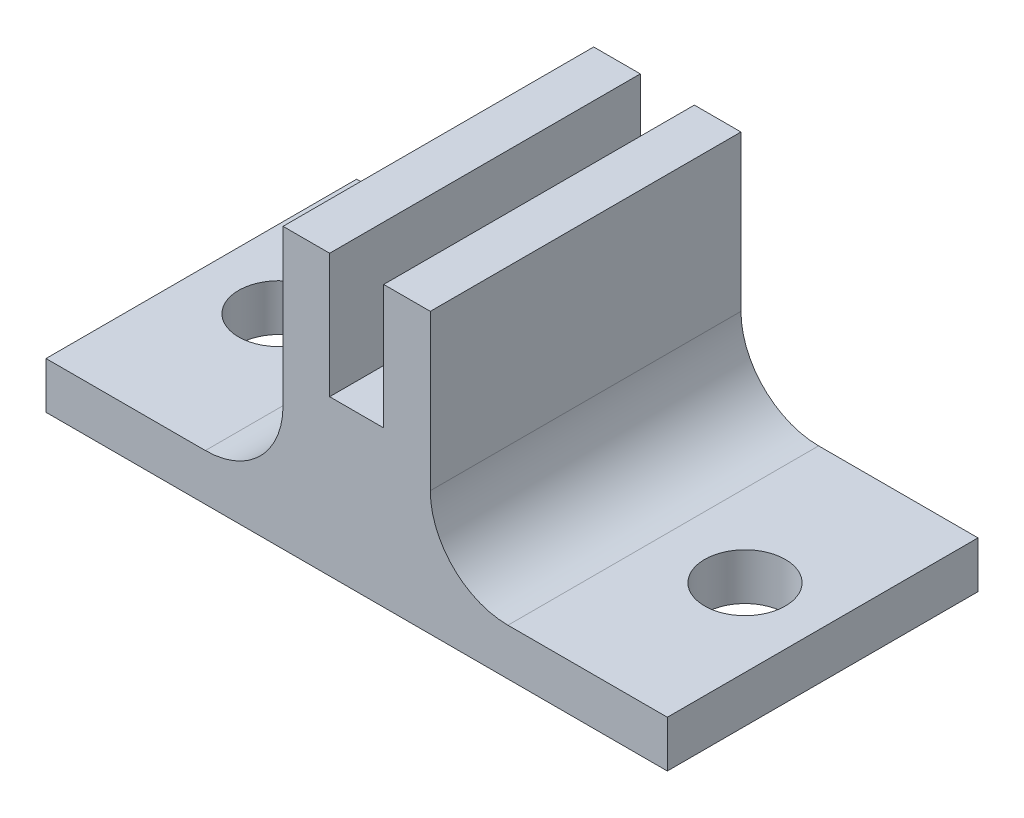
ISO-10303-21;
HEADER;
FILE_DESCRIPTION(('STEP AP214'),'2;1');
FILE_NAME('part.step','',(''),(''),'','','');
FILE_SCHEMA(('AUTOMOTIVE_DESIGN { 1 0 10303 214 1 1 1 1 }'));
ENDSEC;
DATA;
#1=APPLICATION_CONTEXT('core data for automotive mechanical design processes');
#2=APPLICATION_PROTOCOL_DEFINITION('international standard','automotive_design',2000,#1);
#3=PRODUCT_CONTEXT('',#1,'mechanical');
#4=PRODUCT('Part','Part','',(#3));
#5=PRODUCT_RELATED_PRODUCT_CATEGORY('part','',(#4));
#6=PRODUCT_DEFINITION_FORMATION('','',#4);
#7=PRODUCT_DEFINITION_CONTEXT('part definition',#1,'design');
#8=PRODUCT_DEFINITION('design','',#6,#7);
#9=PRODUCT_DEFINITION_SHAPE('','',#8);
#10=(LENGTH_UNIT() NAMED_UNIT(*) SI_UNIT(.MILLI.,.METRE.));
#11=(NAMED_UNIT(*) PLANE_ANGLE_UNIT() SI_UNIT($,.RADIAN.));
#12=(NAMED_UNIT(*) SI_UNIT($,.STERADIAN.) SOLID_ANGLE_UNIT());
#13=UNCERTAINTY_MEASURE_WITH_UNIT(LENGTH_MEASURE(1.E-05),#10,'distance_accuracy_value','');
#14=(GEOMETRIC_REPRESENTATION_CONTEXT(3) GLOBAL_UNCERTAINTY_ASSIGNED_CONTEXT((#13)) GLOBAL_UNIT_ASSIGNED_CONTEXT((#10,
#11,#12)) REPRESENTATION_CONTEXT('',''));
#15=CARTESIAN_POINT('',(0.,0.,0.));
#16=DIRECTION('',(0.,0.,1.));
#17=DIRECTION('',(1.,0.,0.));
#18=AXIS2_PLACEMENT_3D('',#15,#16,#17);
#19=CARTESIAN_POINT('',(0.,3.,0.));
#20=DIRECTION('',(0.,-1.,0.));
#21=DIRECTION('',(0.,0.,-1.));
#22=AXIS2_PLACEMENT_3D('',#19,#20,#21);
#23=PLANE('',#22);
#24=CARTESIAN_POINT('',(-15.,3.,0.));
#25=DIRECTION('',(0.,1.,0.));
#26=DIRECTION('',(0.,0.,1.));
#27=AXIS2_PLACEMENT_3D('',#24,#25,#26);
#28=CIRCLE('',#27,2.6);
#29=CARTESIAN_POINT('',(-15.,3.,2.6));
#30=VERTEX_POINT('',#29);
#31=EDGE_CURVE('E226',#30,#30,#28,.T.);
#32=ORIENTED_EDGE('',*,*,#31,.F.);
#33=EDGE_LOOP('',(#32));
#34=FACE_BOUND('',#33,.T.);
#35=DIRECTION('',(1.,0.,0.));
#36=VECTOR('',#35,1.);
#37=CARTESIAN_POINT('',(-20.,3.,10.));
#38=LINE('',#37,#36);
#39=CARTESIAN_POINT('',(-20.,3.,10.));
#40=VERTEX_POINT('',#39);
#41=CARTESIAN_POINT('',(-9.73999999999999,3.,10.));
#42=VERTEX_POINT('',#41);
#43=EDGE_CURVE('E242',#40,#42,#38,.T.);
#44=ORIENTED_EDGE('',*,*,#43,.T.);
#45=DIRECTION('',(0.,0.,1.));
#46=VECTOR('',#45,1.);
#47=CARTESIAN_POINT('',(-9.73999999999999,3.,-10.));
#48=LINE('',#47,#46);
#49=CARTESIAN_POINT('',(-9.73999999999999,3.,-10.));
#50=VERTEX_POINT('',#49);
#51=EDGE_CURVE('E276',#42,#50,#48,.F.);
#52=ORIENTED_EDGE('',*,*,#51,.T.);
#53=DIRECTION('',(-1.,0.,0.));
#54=VECTOR('',#53,1.);
#55=CARTESIAN_POINT('',(-20.,3.,-10.));
#56=LINE('',#55,#54);
#57=CARTESIAN_POINT('',(-20.,3.,-10.));
#58=VERTEX_POINT('',#57);
#59=EDGE_CURVE('E240',#50,#58,#56,.T.);
#60=ORIENTED_EDGE('',*,*,#59,.T.);
#61=DIRECTION('',(0.,0.,1.));
#62=VECTOR('',#61,1.);
#63=CARTESIAN_POINT('',(-20.,3.,10.));
#64=LINE('',#63,#62);
#65=EDGE_CURVE('E241',#58,#40,#64,.T.);
#66=ORIENTED_EDGE('',*,*,#65,.T.);
#67=EDGE_LOOP('',(#44,#52,#60,#66));
#68=FACE_BOUND('',#67,.T.);
#69=ADVANCED_FACE('F39',(#34,#68),#23,.F.);
#70=CARTESIAN_POINT('',(15.,3.,0.));
#71=DIRECTION('',(0.,1.,0.));
#72=DIRECTION('',(0.,0.,-1.));
#73=AXIS2_PLACEMENT_3D('',#70,#71,#72);
#74=CIRCLE('',#73,2.6);
#75=CARTESIAN_POINT('',(15.,3.,-2.6));
#76=VERTEX_POINT('',#75);
#77=EDGE_CURVE('E221',#76,#76,#74,.T.);
#78=ORIENTED_EDGE('',*,*,#77,.F.);
#79=EDGE_LOOP('',(#78));
#80=FACE_BOUND('',#79,.T.);
#81=CARTESIAN_POINT('',(20.,3.,-10.));
#82=VERTEX_POINT('',#81);
#83=CARTESIAN_POINT('',(9.74,3.,-10.));
#84=VERTEX_POINT('',#83);
#85=EDGE_CURVE('E237',#82,#84,#56,.T.);
#86=ORIENTED_EDGE('',*,*,#85,.T.);
#87=DIRECTION('',(0.,0.,-1.));
#88=VECTOR('',#87,1.);
#89=CARTESIAN_POINT('',(9.74,3.,10.));
#90=LINE('',#89,#88);
#91=CARTESIAN_POINT('',(9.74,3.,10.));
#92=VERTEX_POINT('',#91);
#93=EDGE_CURVE('E58',#84,#92,#90,.F.);
#94=ORIENTED_EDGE('',*,*,#93,.T.);
#95=CARTESIAN_POINT('',(20.,3.,10.));
#96=VERTEX_POINT('',#95);
#97=EDGE_CURVE('E243',#92,#96,#38,.T.);
#98=ORIENTED_EDGE('',*,*,#97,.T.);
#99=DIRECTION('',(0.,0.,-1.));
#100=VECTOR('',#99,1.);
#101=CARTESIAN_POINT('',(20.,3.,10.));
#102=LINE('',#101,#100);
#103=EDGE_CURVE('E234',#96,#82,#102,.T.);
#104=ORIENTED_EDGE('',*,*,#103,.T.);
#105=EDGE_LOOP('',(#86,#94,#98,#104));
#106=FACE_BOUND('',#105,.T.);
#107=ADVANCED_FACE('F383',(#80,#106),#23,.F.);
#108=CARTESIAN_POINT('',(0.,0.,0.));
#109=DIRECTION('',(0.,-1.,0.));
#110=DIRECTION('',(0.,0.,-1.));
#111=AXIS2_PLACEMENT_3D('',#108,#109,#110);
#112=PLANE('',#111);
#113=DIRECTION('',(0.,0.,1.));
#114=VECTOR('',#113,1.);
#115=CARTESIAN_POINT('',(-20.,0.,10.));
#116=LINE('',#115,#114);
#117=CARTESIAN_POINT('',(-20.,0.,-10.));
#118=VERTEX_POINT('',#117);
#119=CARTESIAN_POINT('',(-20.,0.,10.));
#120=VERTEX_POINT('',#119);
#121=EDGE_CURVE('E255',#118,#120,#116,.T.);
#122=ORIENTED_EDGE('',*,*,#121,.F.);
#123=DIRECTION('',(-1.,0.,0.));
#124=VECTOR('',#123,1.);
#125=CARTESIAN_POINT('',(-20.,0.,-10.));
#126=LINE('',#125,#124);
#127=CARTESIAN_POINT('',(20.,0.,-10.));
#128=VERTEX_POINT('',#127);
#129=EDGE_CURVE('E249',#128,#118,#126,.T.);
#130=ORIENTED_EDGE('',*,*,#129,.F.);
#131=DIRECTION('',(0.,0.,-1.));
#132=VECTOR('',#131,1.);
#133=CARTESIAN_POINT('',(20.,0.,10.));
#134=LINE('',#133,#132);
#135=CARTESIAN_POINT('',(20.,0.,10.));
#136=VERTEX_POINT('',#135);
#137=EDGE_CURVE('E233',#136,#128,#134,.T.);
#138=ORIENTED_EDGE('',*,*,#137,.F.);
#139=DIRECTION('',(1.,0.,0.));
#140=VECTOR('',#139,1.);
#141=CARTESIAN_POINT('',(-20.,0.,10.));
#142=LINE('',#141,#140);
#143=EDGE_CURVE('E238',#120,#136,#142,.T.);
#144=ORIENTED_EDGE('',*,*,#143,.F.);
#145=EDGE_LOOP('',(#122,#130,#138,#144));
#146=FACE_BOUND('',#145,.T.);
#147=CARTESIAN_POINT('',(-15.,0.,0.));
#148=DIRECTION('',(0.,1.,0.));
#149=DIRECTION('',(0.,0.,1.));
#150=AXIS2_PLACEMENT_3D('',#147,#148,#149);
#151=CIRCLE('',#150,2.6);
#152=CARTESIAN_POINT('',(-15.,0.,2.6));
#153=VERTEX_POINT('',#152);
#154=EDGE_CURVE('E222',#153,#153,#151,.T.);
#155=ORIENTED_EDGE('',*,*,#154,.T.);
#156=EDGE_LOOP('',(#155));
#157=FACE_BOUND('',#156,.T.);
#158=CARTESIAN_POINT('',(15.,0.,0.));
#159=DIRECTION('',(0.,1.,0.));
#160=DIRECTION('',(0.,0.,-1.));
#161=AXIS2_PLACEMENT_3D('',#158,#159,#160);
#162=CIRCLE('',#161,2.6);
#163=CARTESIAN_POINT('',(15.,0.,-2.6));
#164=VERTEX_POINT('',#163);
#165=EDGE_CURVE('E199',#164,#164,#162,.T.);
#166=ORIENTED_EDGE('',*,*,#165,.T.);
#167=EDGE_LOOP('',(#166));
#168=FACE_BOUND('',#167,.T.);
#169=ADVANCED_FACE('F311',(#146,#157,#168),#112,.T.);
#170=CARTESIAN_POINT('',(20.,3.,10.));
#171=DIRECTION('',(-1.,0.,0.));
#172=DIRECTION('',(0.,0.,1.));
#173=AXIS2_PLACEMENT_3D('',#170,#171,#172);
#174=PLANE('',#173);
#175=ORIENTED_EDGE('',*,*,#137,.T.);
#176=DIRECTION('',(0.,-1.,0.));
#177=VECTOR('',#176,1.);
#178=CARTESIAN_POINT('',(20.,3.,-10.));
#179=LINE('',#178,#177);
#180=EDGE_CURVE('E183',#82,#128,#179,.T.);
#181=ORIENTED_EDGE('',*,*,#180,.F.);
#182=ORIENTED_EDGE('',*,*,#103,.F.);
#183=DIRECTION('',(0.,-1.,0.));
#184=VECTOR('',#183,1.);
#185=CARTESIAN_POINT('',(20.,3.,10.));
#186=LINE('',#185,#184);
#187=EDGE_CURVE('E250',#96,#136,#186,.T.);
#188=ORIENTED_EDGE('',*,*,#187,.T.);
#189=EDGE_LOOP('',(#175,#181,#182,#188));
#190=FACE_BOUND('',#189,.T.);
#191=ADVANCED_FACE('F314',(#190),#174,.F.);
#192=CARTESIAN_POINT('',(-20.,3.,-10.));
#193=DIRECTION('',(0.,0.,1.));
#194=DIRECTION('',(1.,0.,0.));
#195=AXIS2_PLACEMENT_3D('',#192,#193,#194);
#196=PLANE('',#195);
#197=DIRECTION('',(0.,-1.,0.));
#198=VECTOR('',#197,1.);
#199=CARTESIAN_POINT('',(-1.73999999999999,18.,-10.));
#200=LINE('',#199,#198);
#201=CARTESIAN_POINT('',(-1.73999999999999,18.,-10.));
#202=VERTEX_POINT('',#201);
#203=CARTESIAN_POINT('',(-1.73999999999999,10.,-10.));
#204=VERTEX_POINT('',#203);
#205=EDGE_CURVE('E179',#202,#204,#200,.T.);
#206=ORIENTED_EDGE('',*,*,#205,.T.);
#207=DIRECTION('',(1.,0.,0.));
#208=VECTOR('',#207,1.);
#209=CARTESIAN_POINT('',(-29.1531112314674,10.,-10.));
#210=LINE('',#209,#208);
#211=CARTESIAN_POINT('',(1.74,10.,-10.));
#212=VERTEX_POINT('',#211);
#213=EDGE_CURVE('E163',#204,#212,#210,.T.);
#214=ORIENTED_EDGE('',*,*,#213,.T.);
#215=DIRECTION('',(0.,-1.,0.));
#216=VECTOR('',#215,1.);
#217=CARTESIAN_POINT('',(1.74,18.,-10.));
#218=LINE('',#217,#216);
#219=CARTESIAN_POINT('',(1.74,18.,-10.));
#220=VERTEX_POINT('',#219);
#221=EDGE_CURVE('E205',#220,#212,#218,.T.);
#222=ORIENTED_EDGE('',*,*,#221,.F.);
#223=DIRECTION('',(-1.,0.,0.));
#224=VECTOR('',#223,1.);
#225=CARTESIAN_POINT('',(4.74,18.,-10.));
#226=LINE('',#225,#224);
#227=CARTESIAN_POINT('',(4.74,18.,-10.));
#228=VERTEX_POINT('',#227);
#229=EDGE_CURVE('E218',#228,#220,#226,.T.);
#230=ORIENTED_EDGE('',*,*,#229,.F.);
#231=DIRECTION('',(0.,-1.,0.));
#232=VECTOR('',#231,1.);
#233=CARTESIAN_POINT('',(4.74,18.,-10.));
#234=LINE('',#233,#232);
#235=CARTESIAN_POINT('',(4.74,8.,-10.));
#236=VERTEX_POINT('',#235);
#237=EDGE_CURVE('E204',#228,#236,#234,.T.);
#238=ORIENTED_EDGE('',*,*,#237,.T.);
#239=CARTESIAN_POINT('',(9.74,8.,-10.));
#240=DIRECTION('',(0.,0.,1.));
#241=DIRECTION('',(1.,0.,0.));
#242=AXIS2_PLACEMENT_3D('',#239,#240,#241);
#243=CIRCLE('',#242,5.);
#244=EDGE_CURVE('E50',#236,#84,#243,.T.);
#245=ORIENTED_EDGE('',*,*,#244,.T.);
#246=ORIENTED_EDGE('',*,*,#85,.F.);
#247=ORIENTED_EDGE('',*,*,#180,.T.);
#248=ORIENTED_EDGE('',*,*,#129,.T.);
#249=DIRECTION('',(0.,-1.,0.));
#250=VECTOR('',#249,1.);
#251=CARTESIAN_POINT('',(-20.,3.,-10.));
#252=LINE('',#251,#250);
#253=EDGE_CURVE('E257',#58,#118,#252,.T.);
#254=ORIENTED_EDGE('',*,*,#253,.F.);
#255=ORIENTED_EDGE('',*,*,#59,.F.);
#256=CARTESIAN_POINT('',(-9.73999999999999,8.,-10.));
#257=DIRECTION('',(0.,0.,1.));
#258=DIRECTION('',(1.,0.,0.));
#259=AXIS2_PLACEMENT_3D('',#256,#257,#258);
#260=CIRCLE('',#259,5.);
#261=CARTESIAN_POINT('',(-4.73999999999999,8.,-10.));
#262=VERTEX_POINT('',#261);
#263=EDGE_CURVE('E284',#50,#262,#260,.T.);
#264=ORIENTED_EDGE('',*,*,#263,.T.);
#265=DIRECTION('',(0.,-1.,0.));
#266=VECTOR('',#265,1.);
#267=CARTESIAN_POINT('',(-4.73999999999999,18.,-10.));
#268=LINE('',#267,#266);
#269=CARTESIAN_POINT('',(-4.73999999999999,18.,-10.));
#270=VERTEX_POINT('',#269);
#271=EDGE_CURVE('E188',#270,#262,#268,.T.);
#272=ORIENTED_EDGE('',*,*,#271,.F.);
#273=DIRECTION('',(-1.,0.,0.));
#274=VECTOR('',#273,1.);
#275=CARTESIAN_POINT('',(-4.73999999999999,18.,-10.));
#276=LINE('',#275,#274);
#277=EDGE_CURVE('E189',#202,#270,#276,.T.);
#278=ORIENTED_EDGE('',*,*,#277,.F.);
#279=EDGE_LOOP('',(#206,#214,#222,#230,#238,#245,#246,#247,#248,#254,#255,#264,#272,#278));
#280=FACE_BOUND('',#279,.T.);
#281=ADVANCED_FACE('F187',(#280),#196,.F.);
#282=CARTESIAN_POINT('',(-20.,3.,10.));
#283=DIRECTION('',(1.,0.,0.));
#284=DIRECTION('',(0.,0.,-1.));
#285=AXIS2_PLACEMENT_3D('',#282,#283,#284);
#286=PLANE('',#285);
#287=ORIENTED_EDGE('',*,*,#121,.T.);
#288=DIRECTION('',(0.,-1.,0.));
#289=VECTOR('',#288,1.);
#290=CARTESIAN_POINT('',(-20.,3.,10.));
#291=LINE('',#290,#289);
#292=EDGE_CURVE('E256',#40,#120,#291,.T.);
#293=ORIENTED_EDGE('',*,*,#292,.F.);
#294=ORIENTED_EDGE('',*,*,#65,.F.);
#295=ORIENTED_EDGE('',*,*,#253,.T.);
#296=EDGE_LOOP('',(#287,#293,#294,#295));
#297=FACE_BOUND('',#296,.T.);
#298=ADVANCED_FACE('F304',(#297),#286,.F.);
#299=CARTESIAN_POINT('',(-20.,3.,10.));
#300=DIRECTION('',(0.,0.,-1.));
#301=DIRECTION('',(-1.,0.,0.));
#302=AXIS2_PLACEMENT_3D('',#299,#300,#301);
#303=PLANE('',#302);
#304=DIRECTION('',(0.,-1.,0.));
#305=VECTOR('',#304,1.);
#306=CARTESIAN_POINT('',(1.74,18.,10.));
#307=LINE('',#306,#305);
#308=CARTESIAN_POINT('',(1.74,18.,10.));
#309=VERTEX_POINT('',#308);
#310=CARTESIAN_POINT('',(1.74,10.,10.));
#311=VERTEX_POINT('',#310);
#312=EDGE_CURVE('E207',#309,#311,#307,.T.);
#313=ORIENTED_EDGE('',*,*,#312,.T.);
#314=DIRECTION('',(1.,0.,0.));
#315=VECTOR('',#314,1.);
#316=CARTESIAN_POINT('',(-29.1531112314674,10.,10.));
#317=LINE('',#316,#315);
#318=CARTESIAN_POINT('',(-1.73999999999999,10.,10.));
#319=VERTEX_POINT('',#318);
#320=EDGE_CURVE('E331',#319,#311,#317,.T.);
#321=ORIENTED_EDGE('',*,*,#320,.F.);
#322=DIRECTION('',(0.,-1.,0.));
#323=VECTOR('',#322,1.);
#324=CARTESIAN_POINT('',(-1.73999999999999,18.,10.));
#325=LINE('',#324,#323);
#326=CARTESIAN_POINT('',(-1.73999999999999,18.,10.));
#327=VERTEX_POINT('',#326);
#328=EDGE_CURVE('E186',#327,#319,#325,.T.);
#329=ORIENTED_EDGE('',*,*,#328,.F.);
#330=DIRECTION('',(1.,0.,0.));
#331=VECTOR('',#330,1.);
#332=CARTESIAN_POINT('',(-4.73999999999999,18.,10.));
#333=LINE('',#332,#331);
#334=CARTESIAN_POINT('',(-4.73999999999999,18.,10.));
#335=VERTEX_POINT('',#334);
#336=EDGE_CURVE('E346',#335,#327,#333,.T.);
#337=ORIENTED_EDGE('',*,*,#336,.F.);
#338=DIRECTION('',(0.,-1.,0.));
#339=VECTOR('',#338,1.);
#340=CARTESIAN_POINT('',(-4.73999999999999,18.,10.));
#341=LINE('',#340,#339);
#342=CARTESIAN_POINT('',(-4.73999999999999,8.,10.));
#343=VERTEX_POINT('',#342);
#344=EDGE_CURVE('E191',#335,#343,#341,.T.);
#345=ORIENTED_EDGE('',*,*,#344,.T.);
#346=CARTESIAN_POINT('',(-9.73999999999999,8.,10.));
#347=DIRECTION('',(0.,0.,-1.));
#348=DIRECTION('',(-1.,0.,0.));
#349=AXIS2_PLACEMENT_3D('',#346,#347,#348);
#350=CIRCLE('',#349,5.);
#351=EDGE_CURVE('E281',#343,#42,#350,.T.);
#352=ORIENTED_EDGE('',*,*,#351,.T.);
#353=ORIENTED_EDGE('',*,*,#43,.F.);
#354=ORIENTED_EDGE('',*,*,#292,.T.);
#355=ORIENTED_EDGE('',*,*,#143,.T.);
#356=ORIENTED_EDGE('',*,*,#187,.F.);
#357=ORIENTED_EDGE('',*,*,#97,.F.);
#358=CARTESIAN_POINT('',(9.74,8.,10.));
#359=DIRECTION('',(0.,0.,-1.));
#360=DIRECTION('',(-1.,0.,0.));
#361=AXIS2_PLACEMENT_3D('',#358,#359,#360);
#362=CIRCLE('',#361,5.);
#363=CARTESIAN_POINT('',(4.74,8.,10.));
#364=VERTEX_POINT('',#363);
#365=EDGE_CURVE('E11',#92,#364,#362,.T.);
#366=ORIENTED_EDGE('',*,*,#365,.T.);
#367=DIRECTION('',(0.,-1.,0.));
#368=VECTOR('',#367,1.);
#369=CARTESIAN_POINT('',(4.74,18.,10.));
#370=LINE('',#369,#368);
#371=CARTESIAN_POINT('',(4.74,18.,10.));
#372=VERTEX_POINT('',#371);
#373=EDGE_CURVE('E209',#372,#364,#370,.T.);
#374=ORIENTED_EDGE('',*,*,#373,.F.);
#375=DIRECTION('',(1.,0.,0.));
#376=VECTOR('',#375,1.);
#377=CARTESIAN_POINT('',(4.74,18.,10.));
#378=LINE('',#377,#376);
#379=EDGE_CURVE('E211',#309,#372,#378,.T.);
#380=ORIENTED_EDGE('',*,*,#379,.F.);
#381=EDGE_LOOP('',(#313,#321,#329,#337,#345,#352,#353,#354,#355,#356,#357,#366,#374,#380));
#382=FACE_BOUND('',#381,.T.);
#383=ADVANCED_FACE('F297',(#382),#303,.F.);
#384=CARTESIAN_POINT('',(-15.,3.,0.));
#385=DIRECTION('',(0.,-1.,0.));
#386=DIRECTION('',(0.,0.,-1.));
#387=AXIS2_PLACEMENT_3D('',#384,#385,#386);
#388=CYLINDRICAL_SURFACE('',#387,2.6);
#389=ORIENTED_EDGE('',*,*,#31,.T.);
#390=EDGE_LOOP('',(#389));
#391=FACE_BOUND('',#390,.T.);
#392=ORIENTED_EDGE('',*,*,#154,.F.);
#393=EDGE_LOOP('',(#392));
#394=FACE_BOUND('',#393,.T.);
#395=ADVANCED_FACE('F394',(#391,#394),#388,.F.);
#396=CARTESIAN_POINT('',(15.,3.,0.));
#397=DIRECTION('',(0.,-1.,0.));
#398=DIRECTION('',(0.,0.,-1.));
#399=AXIS2_PLACEMENT_3D('',#396,#397,#398);
#400=CYLINDRICAL_SURFACE('',#399,2.6);
#401=ORIENTED_EDGE('',*,*,#77,.T.);
#402=EDGE_LOOP('',(#401));
#403=FACE_BOUND('',#402,.T.);
#404=ORIENTED_EDGE('',*,*,#165,.F.);
#405=EDGE_LOOP('',(#404));
#406=FACE_BOUND('',#405,.T.);
#407=ADVANCED_FACE('F511',(#403,#406),#400,.F.);
#408=CARTESIAN_POINT('',(4.74,18.,10.));
#409=DIRECTION('',(-1.,0.,0.));
#410=DIRECTION('',(0.,0.,1.));
#411=AXIS2_PLACEMENT_3D('',#408,#409,#410);
#412=PLANE('',#411);
#413=ORIENTED_EDGE('',*,*,#373,.T.);
#414=DIRECTION('',(0.,0.,-1.));
#415=VECTOR('',#414,1.);
#416=CARTESIAN_POINT('',(4.74,8.,-10.));
#417=LINE('',#416,#415);
#418=EDGE_CURVE('E278',#364,#236,#417,.T.);
#419=ORIENTED_EDGE('',*,*,#418,.T.);
#420=ORIENTED_EDGE('',*,*,#237,.F.);
#421=DIRECTION('',(0.,0.,-1.));
#422=VECTOR('',#421,1.);
#423=CARTESIAN_POINT('',(4.74,18.,10.));
#424=LINE('',#423,#422);
#425=EDGE_CURVE('E216',#372,#228,#424,.T.);
#426=ORIENTED_EDGE('',*,*,#425,.F.);
#427=EDGE_LOOP('',(#413,#419,#420,#426));
#428=FACE_BOUND('',#427,.T.);
#429=ADVANCED_FACE('F325',(#428),#412,.F.);
#430=CARTESIAN_POINT('',(1.74,18.,10.));
#431=DIRECTION('',(1.,0.,0.));
#432=DIRECTION('',(0.,0.,-1.));
#433=AXIS2_PLACEMENT_3D('',#430,#431,#432);
#434=PLANE('',#433);
#435=DIRECTION('',(0.,-1.,0.));
#436=VECTOR('',#435,1.);
#437=CARTESIAN_POINT('',(1.74,18.,1.55));
#438=LINE('',#437,#436);
#439=CARTESIAN_POINT('',(1.74,14.,1.55));
#440=VERTEX_POINT('',#439);
#441=CARTESIAN_POINT('',(1.74,10.,1.55));
#442=VERTEX_POINT('',#441);
#443=EDGE_CURVE('E336',#440,#442,#438,.T.);
#444=ORIENTED_EDGE('',*,*,#443,.T.);
#445=DIRECTION('',(0.,0.,1.));
#446=VECTOR('',#445,1.);
#447=CARTESIAN_POINT('',(1.74,10.,10.));
#448=LINE('',#447,#446);
#449=EDGE_CURVE('E203',#442,#311,#448,.T.);
#450=ORIENTED_EDGE('',*,*,#449,.T.);
#451=ORIENTED_EDGE('',*,*,#312,.F.);
#452=DIRECTION('',(0.,0.,1.));
#453=VECTOR('',#452,1.);
#454=CARTESIAN_POINT('',(1.74,18.,10.));
#455=LINE('',#454,#453);
#456=EDGE_CURVE('E213',#220,#309,#455,.T.);
#457=ORIENTED_EDGE('',*,*,#456,.F.);
#458=ORIENTED_EDGE('',*,*,#221,.T.);
#459=DIRECTION('',(0.,0.,1.));
#460=VECTOR('',#459,1.);
#461=CARTESIAN_POINT('',(1.74,10.,10.));
#462=LINE('',#461,#460);
#463=CARTESIAN_POINT('',(1.74,10.,-1.55));
#464=VERTEX_POINT('',#463);
#465=EDGE_CURVE('E166',#212,#464,#462,.T.);
#466=ORIENTED_EDGE('',*,*,#465,.T.);
#467=DIRECTION('',(0.,1.,0.));
#468=VECTOR('',#467,1.);
#469=CARTESIAN_POINT('',(1.74,18.,-1.55));
#470=LINE('',#469,#468);
#471=CARTESIAN_POINT('',(1.74,14.,-1.55));
#472=VERTEX_POINT('',#471);
#473=EDGE_CURVE('E370',#464,#472,#470,.T.);
#474=ORIENTED_EDGE('',*,*,#473,.T.);
#475=DIRECTION('',(0.,0.,1.));
#476=VECTOR('',#475,1.);
#477=CARTESIAN_POINT('',(1.74,14.,10.));
#478=LINE('',#477,#476);
#479=EDGE_CURVE('E345',#472,#440,#478,.T.);
#480=ORIENTED_EDGE('',*,*,#479,.T.);
#481=EDGE_LOOP('',(#444,#450,#451,#457,#458,#466,#474,#480));
#482=FACE_BOUND('',#481,.T.);
#483=ADVANCED_FACE('F337',(#482),#434,.F.);
#484=CARTESIAN_POINT('',(0.,18.,0.));
#485=DIRECTION('',(0.,1.,0.));
#486=DIRECTION('',(0.,0.,1.));
#487=AXIS2_PLACEMENT_3D('',#484,#485,#486);
#488=PLANE('',#487);
#489=ORIENTED_EDGE('',*,*,#425,.T.);
#490=ORIENTED_EDGE('',*,*,#229,.T.);
#491=ORIENTED_EDGE('',*,*,#456,.T.);
#492=ORIENTED_EDGE('',*,*,#379,.T.);
#493=EDGE_LOOP('',(#489,#490,#491,#492));
#494=FACE_BOUND('',#493,.T.);
#495=ADVANCED_FACE('F330',(#494),#488,.T.);
#496=CARTESIAN_POINT('',(-4.73999999999999,18.,-10.));
#497=DIRECTION('',(1.,0.,0.));
#498=DIRECTION('',(0.,0.,-1.));
#499=AXIS2_PLACEMENT_3D('',#496,#497,#498);
#500=PLANE('',#499);
#501=ORIENTED_EDGE('',*,*,#271,.T.);
#502=DIRECTION('',(0.,0.,1.));
#503=VECTOR('',#502,1.);
#504=CARTESIAN_POINT('',(-4.73999999999999,8.,10.));
#505=LINE('',#504,#503);
#506=EDGE_CURVE('E274',#262,#343,#505,.T.);
#507=ORIENTED_EDGE('',*,*,#506,.T.);
#508=ORIENTED_EDGE('',*,*,#344,.F.);
#509=DIRECTION('',(0.,0.,1.));
#510=VECTOR('',#509,1.);
#511=CARTESIAN_POINT('',(-4.73999999999999,18.,-10.));
#512=LINE('',#511,#510);
#513=EDGE_CURVE('E224',#270,#335,#512,.T.);
#514=ORIENTED_EDGE('',*,*,#513,.F.);
#515=EDGE_LOOP('',(#501,#507,#508,#514));
#516=FACE_BOUND('',#515,.T.);
#517=ADVANCED_FACE('F295',(#516),#500,.F.);
#518=CARTESIAN_POINT('',(-1.73999999999999,18.,-10.));
#519=DIRECTION('',(-1.,0.,0.));
#520=DIRECTION('',(0.,0.,1.));
#521=AXIS2_PLACEMENT_3D('',#518,#519,#520);
#522=PLANE('',#521);
#523=ORIENTED_EDGE('',*,*,#328,.T.);
#524=DIRECTION('',(0.,0.,-1.));
#525=VECTOR('',#524,1.);
#526=CARTESIAN_POINT('',(-1.73999999999999,10.,-10.));
#527=LINE('',#526,#525);
#528=CARTESIAN_POINT('',(-1.73999999999999,10.,1.55));
#529=VERTEX_POINT('',#528);
#530=EDGE_CURVE('E272',#319,#529,#527,.T.);
#531=ORIENTED_EDGE('',*,*,#530,.T.);
#532=DIRECTION('',(0.,1.,0.));
#533=VECTOR('',#532,1.);
#534=CARTESIAN_POINT('',(-1.73999999999999,18.,1.55));
#535=LINE('',#534,#533);
#536=CARTESIAN_POINT('',(-1.73999999999999,14.,1.55));
#537=VERTEX_POINT('',#536);
#538=EDGE_CURVE('E270',#529,#537,#535,.T.);
#539=ORIENTED_EDGE('',*,*,#538,.T.);
#540=DIRECTION('',(0.,0.,-1.));
#541=VECTOR('',#540,1.);
#542=CARTESIAN_POINT('',(-1.73999999999999,14.,-10.));
#543=LINE('',#542,#541);
#544=CARTESIAN_POINT('',(-1.73999999999999,14.,-1.55));
#545=VERTEX_POINT('',#544);
#546=EDGE_CURVE('E269',#537,#545,#543,.T.);
#547=ORIENTED_EDGE('',*,*,#546,.T.);
#548=DIRECTION('',(0.,-1.,0.));
#549=VECTOR('',#548,1.);
#550=CARTESIAN_POINT('',(-1.73999999999999,18.,-1.55));
#551=LINE('',#550,#549);
#552=CARTESIAN_POINT('',(-1.73999999999999,10.,-1.55));
#553=VERTEX_POINT('',#552);
#554=EDGE_CURVE('E182',#545,#553,#551,.T.);
#555=ORIENTED_EDGE('',*,*,#554,.T.);
#556=DIRECTION('',(0.,0.,-1.));
#557=VECTOR('',#556,1.);
#558=CARTESIAN_POINT('',(-1.73999999999999,10.,-10.));
#559=LINE('',#558,#557);
#560=EDGE_CURVE('E164',#553,#204,#559,.T.);
#561=ORIENTED_EDGE('',*,*,#560,.T.);
#562=ORIENTED_EDGE('',*,*,#205,.F.);
#563=DIRECTION('',(0.,0.,-1.));
#564=VECTOR('',#563,1.);
#565=CARTESIAN_POINT('',(-1.73999999999999,18.,-10.));
#566=LINE('',#565,#564);
#567=EDGE_CURVE('E349',#327,#202,#566,.T.);
#568=ORIENTED_EDGE('',*,*,#567,.F.);
#569=EDGE_LOOP('',(#523,#531,#539,#547,#555,#561,#562,#568));
#570=FACE_BOUND('',#569,.T.);
#571=ADVANCED_FACE('F178',(#570),#522,.F.);
#572=CARTESIAN_POINT('',(0.,18.,0.));
#573=DIRECTION('',(0.,1.,0.));
#574=DIRECTION('',(0.,0.,1.));
#575=AXIS2_PLACEMENT_3D('',#572,#573,#574);
#576=PLANE('',#575);
#577=ORIENTED_EDGE('',*,*,#513,.T.);
#578=ORIENTED_EDGE('',*,*,#336,.T.);
#579=ORIENTED_EDGE('',*,*,#567,.T.);
#580=ORIENTED_EDGE('',*,*,#277,.T.);
#581=EDGE_LOOP('',(#577,#578,#579,#580));
#582=FACE_BOUND('',#581,.T.);
#583=ADVANCED_FACE('F351',(#582),#576,.T.);
#584=CARTESIAN_POINT('',(-29.1531112314674,10.,10.));
#585=DIRECTION('',(0.,1.,0.));
#586=DIRECTION('',(0.,0.,1.));
#587=AXIS2_PLACEMENT_3D('',#584,#585,#586);
#588=PLANE('',#587);
#589=ORIENTED_EDGE('',*,*,#449,.F.);
#590=DIRECTION('',(1.,0.,0.));
#591=VECTOR('',#590,1.);
#592=CARTESIAN_POINT('',(-29.1531112314674,10.,1.55));
#593=LINE('',#592,#591);
#594=EDGE_CURVE('E353',#529,#442,#593,.T.);
#595=ORIENTED_EDGE('',*,*,#594,.F.);
#596=ORIENTED_EDGE('',*,*,#530,.F.);
#597=ORIENTED_EDGE('',*,*,#320,.T.);
#598=EDGE_LOOP('',(#589,#595,#596,#597));
#599=FACE_BOUND('',#598,.T.);
#600=ADVANCED_FACE('F355',(#599),#588,.T.);
#601=CARTESIAN_POINT('',(-29.1531112314674,10.,1.55));
#602=DIRECTION('',(0.,0.,1.));
#603=DIRECTION('',(1.,0.,0.));
#604=AXIS2_PLACEMENT_3D('',#601,#602,#603);
#605=PLANE('',#604);
#606=ORIENTED_EDGE('',*,*,#443,.F.);
#607=DIRECTION('',(1.,0.,0.));
#608=VECTOR('',#607,1.);
#609=CARTESIAN_POINT('',(-29.1531112314674,14.,1.55));
#610=LINE('',#609,#608);
#611=EDGE_CURVE('E358',#537,#440,#610,.T.);
#612=ORIENTED_EDGE('',*,*,#611,.F.);
#613=ORIENTED_EDGE('',*,*,#538,.F.);
#614=ORIENTED_EDGE('',*,*,#594,.T.);
#615=EDGE_LOOP('',(#606,#612,#613,#614));
#616=FACE_BOUND('',#615,.T.);
#617=ADVANCED_FACE('F385',(#616),#605,.T.);
#618=CARTESIAN_POINT('',(-29.1531112314674,14.,1.55));
#619=DIRECTION('',(0.,1.,0.));
#620=DIRECTION('',(0.,0.,1.));
#621=AXIS2_PLACEMENT_3D('',#618,#619,#620);
#622=PLANE('',#621);
#623=ORIENTED_EDGE('',*,*,#479,.F.);
#624=DIRECTION('',(1.,0.,0.));
#625=VECTOR('',#624,1.);
#626=CARTESIAN_POINT('',(-29.1531112314674,14.,-1.55));
#627=LINE('',#626,#625);
#628=EDGE_CURVE('E359',#545,#472,#627,.T.);
#629=ORIENTED_EDGE('',*,*,#628,.F.);
#630=ORIENTED_EDGE('',*,*,#546,.F.);
#631=ORIENTED_EDGE('',*,*,#611,.T.);
#632=EDGE_LOOP('',(#623,#629,#630,#631));
#633=FACE_BOUND('',#632,.T.);
#634=ADVANCED_FACE('F371',(#633),#622,.T.);
#635=CARTESIAN_POINT('',(-29.1531112314674,14.,-1.55));
#636=DIRECTION('',(0.,0.,-1.));
#637=DIRECTION('',(-1.,0.,0.));
#638=AXIS2_PLACEMENT_3D('',#635,#636,#637);
#639=PLANE('',#638);
#640=ORIENTED_EDGE('',*,*,#473,.F.);
#641=DIRECTION('',(1.,0.,0.));
#642=VECTOR('',#641,1.);
#643=CARTESIAN_POINT('',(-29.1531112314674,10.,-1.55));
#644=LINE('',#643,#642);
#645=EDGE_CURVE('E175',#553,#464,#644,.T.);
#646=ORIENTED_EDGE('',*,*,#645,.F.);
#647=ORIENTED_EDGE('',*,*,#554,.F.);
#648=ORIENTED_EDGE('',*,*,#628,.T.);
#649=EDGE_LOOP('',(#640,#646,#647,#648));
#650=FACE_BOUND('',#649,.T.);
#651=ADVANCED_FACE('F372',(#650),#639,.T.);
#652=CARTESIAN_POINT('',(-29.1531112314674,10.,-1.55));
#653=DIRECTION('',(0.,1.,0.));
#654=DIRECTION('',(0.,0.,1.));
#655=AXIS2_PLACEMENT_3D('',#652,#653,#654);
#656=PLANE('',#655);
#657=ORIENTED_EDGE('',*,*,#465,.F.);
#658=ORIENTED_EDGE('',*,*,#213,.F.);
#659=ORIENTED_EDGE('',*,*,#560,.F.);
#660=ORIENTED_EDGE('',*,*,#645,.T.);
#661=EDGE_LOOP('',(#657,#658,#659,#660));
#662=FACE_BOUND('',#661,.T.);
#663=ADVANCED_FACE('F161',(#662),#656,.T.);
#664=CARTESIAN_POINT('',(-9.73999999999999,8.,-10.));
#665=DIRECTION('',(0.,0.,-1.));
#666=DIRECTION('',(-1.,0.,0.));
#667=AXIS2_PLACEMENT_3D('',#664,#665,#666);
#668=CYLINDRICAL_SURFACE('',#667,5.);
#669=ORIENTED_EDGE('',*,*,#263,.F.);
#670=ORIENTED_EDGE('',*,*,#51,.F.);
#671=ORIENTED_EDGE('',*,*,#351,.F.);
#672=ORIENTED_EDGE('',*,*,#506,.F.);
#673=EDGE_LOOP('',(#669,#670,#671,#672));
#674=FACE_BOUND('',#673,.T.);
#675=ADVANCED_FACE('F300',(#674),#668,.F.);
#676=CARTESIAN_POINT('',(9.74,8.,10.));
#677=DIRECTION('',(0.,0.,1.));
#678=DIRECTION('',(1.,0.,0.));
#679=AXIS2_PLACEMENT_3D('',#676,#677,#678);
#680=CYLINDRICAL_SURFACE('',#679,5.);
#681=ORIENTED_EDGE('',*,*,#365,.F.);
#682=ORIENTED_EDGE('',*,*,#93,.F.);
#683=ORIENTED_EDGE('',*,*,#244,.F.);
#684=ORIENTED_EDGE('',*,*,#418,.F.);
#685=EDGE_LOOP('',(#681,#682,#683,#684));
#686=FACE_BOUND('',#685,.T.);
#687=ADVANCED_FACE('F41',(#686),#680,.F.);
#688=CLOSED_SHELL('',(#69,#107,#169,#191,#281,#298,#383,#395,#407,#429,#483,#495,#517,#571,#583,
#600,#617,#634,#651,#663,#675,#687));
#689=MANIFOLD_SOLID_BREP('B2',#688);
#690=ADVANCED_BREP_SHAPE_REPRESENTATION('',(#18,#689),#14);
#691=SHAPE_DEFINITION_REPRESENTATION(#9,#690);
ENDSEC;
END-ISO-10303-21;
